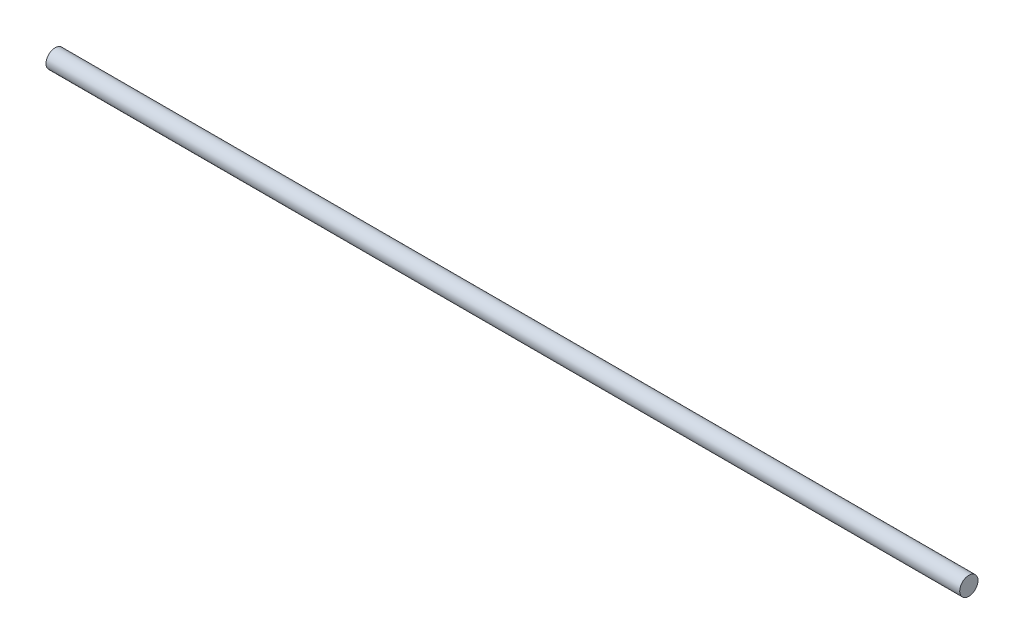
ISO-10303-21;
HEADER;
FILE_DESCRIPTION(('STEP AP214'),'2;1');
FILE_NAME('part.step','',(''),(''),'','','');
FILE_SCHEMA(('AUTOMOTIVE_DESIGN { 1 0 10303 214 1 1 1 1 }'));
ENDSEC;
DATA;
#1=APPLICATION_CONTEXT('core data for automotive mechanical design processes');
#2=APPLICATION_PROTOCOL_DEFINITION('international standard','automotive_design',2000,#1);
#3=PRODUCT_CONTEXT('',#1,'mechanical');
#4=PRODUCT('Part','Part','',(#3));
#5=PRODUCT_RELATED_PRODUCT_CATEGORY('part','',(#4));
#6=PRODUCT_DEFINITION_FORMATION('','',#4);
#7=PRODUCT_DEFINITION_CONTEXT('part definition',#1,'design');
#8=PRODUCT_DEFINITION('design','',#6,#7);
#9=PRODUCT_DEFINITION_SHAPE('','',#8);
#10=(LENGTH_UNIT() NAMED_UNIT(*) SI_UNIT(.MILLI.,.METRE.));
#11=(NAMED_UNIT(*) PLANE_ANGLE_UNIT() SI_UNIT($,.RADIAN.));
#12=(NAMED_UNIT(*) SI_UNIT($,.STERADIAN.) SOLID_ANGLE_UNIT());
#13=UNCERTAINTY_MEASURE_WITH_UNIT(LENGTH_MEASURE(1.E-05),#10,'distance_accuracy_value','');
#14=(GEOMETRIC_REPRESENTATION_CONTEXT(3) GLOBAL_UNCERTAINTY_ASSIGNED_CONTEXT((#13)) GLOBAL_UNIT_ASSIGNED_CONTEXT((#10,
#11,#12)) REPRESENTATION_CONTEXT('',''));
#15=CARTESIAN_POINT('',(0.,0.,0.));
#16=DIRECTION('',(0.,0.,1.));
#17=DIRECTION('',(1.,0.,0.));
#18=AXIS2_PLACEMENT_3D('',#15,#16,#17);
#19=CARTESIAN_POINT('',(400.,0.,0.));
#20=DIRECTION('',(-1.,0.,0.));
#21=DIRECTION('',(0.,0.,1.));
#22=AXIS2_PLACEMENT_3D('',#19,#20,#21);
#23=CYLINDRICAL_SURFACE('',#22,4.);
#24=CARTESIAN_POINT('',(400.,0.,0.));
#25=DIRECTION('',(1.,0.,0.));
#26=DIRECTION('',(0.,0.,-1.));
#27=AXIS2_PLACEMENT_3D('',#24,#25,#26);
#28=CIRCLE('',#27,4.);
#29=CARTESIAN_POINT('',(400.,0.,-4.));
#30=VERTEX_POINT('',#29);
#31=EDGE_CURVE('E10',#30,#30,#28,.T.);
#32=ORIENTED_EDGE('',*,*,#31,.F.);
#33=EDGE_LOOP('',(#32));
#34=FACE_BOUND('',#33,.T.);
#35=CARTESIAN_POINT('',(0.,0.,0.));
#36=DIRECTION('',(1.,0.,0.));
#37=DIRECTION('',(0.,0.,-1.));
#38=AXIS2_PLACEMENT_3D('',#35,#36,#37);
#39=CIRCLE('',#38,4.);
#40=CARTESIAN_POINT('',(0.,0.,-4.));
#41=VERTEX_POINT('',#40);
#42=EDGE_CURVE('E34',#41,#41,#39,.T.);
#43=ORIENTED_EDGE('',*,*,#42,.T.);
#44=EDGE_LOOP('',(#43));
#45=FACE_BOUND('',#44,.T.);
#46=ADVANCED_FACE('F31',(#34,#45),#23,.T.);
#47=CARTESIAN_POINT('',(400.,0.,0.));
#48=DIRECTION('',(1.,0.,0.));
#49=DIRECTION('',(0.,0.,-1.));
#50=AXIS2_PLACEMENT_3D('',#47,#48,#49);
#51=PLANE('',#50);
#52=ORIENTED_EDGE('',*,*,#31,.T.);
#53=EDGE_LOOP('',(#52));
#54=FACE_BOUND('',#53,.T.);
#55=ADVANCED_FACE('F46',(#54),#51,.T.);
#56=CARTESIAN_POINT('',(0.,0.,0.));
#57=DIRECTION('',(1.,0.,0.));
#58=DIRECTION('',(0.,0.,-1.));
#59=AXIS2_PLACEMENT_3D('',#56,#57,#58);
#60=PLANE('',#59);
#61=ORIENTED_EDGE('',*,*,#42,.F.);
#62=EDGE_LOOP('',(#61));
#63=FACE_BOUND('',#62,.T.);
#64=ADVANCED_FACE('F44',(#63),#60,.F.);
#65=CLOSED_SHELL('',(#46,#55,#64));
#66=MANIFOLD_SOLID_BREP('B2',#65);
#67=ADVANCED_BREP_SHAPE_REPRESENTATION('',(#18,#66),#14);
#68=SHAPE_DEFINITION_REPRESENTATION(#9,#67);
ENDSEC;
END-ISO-10303-21;
